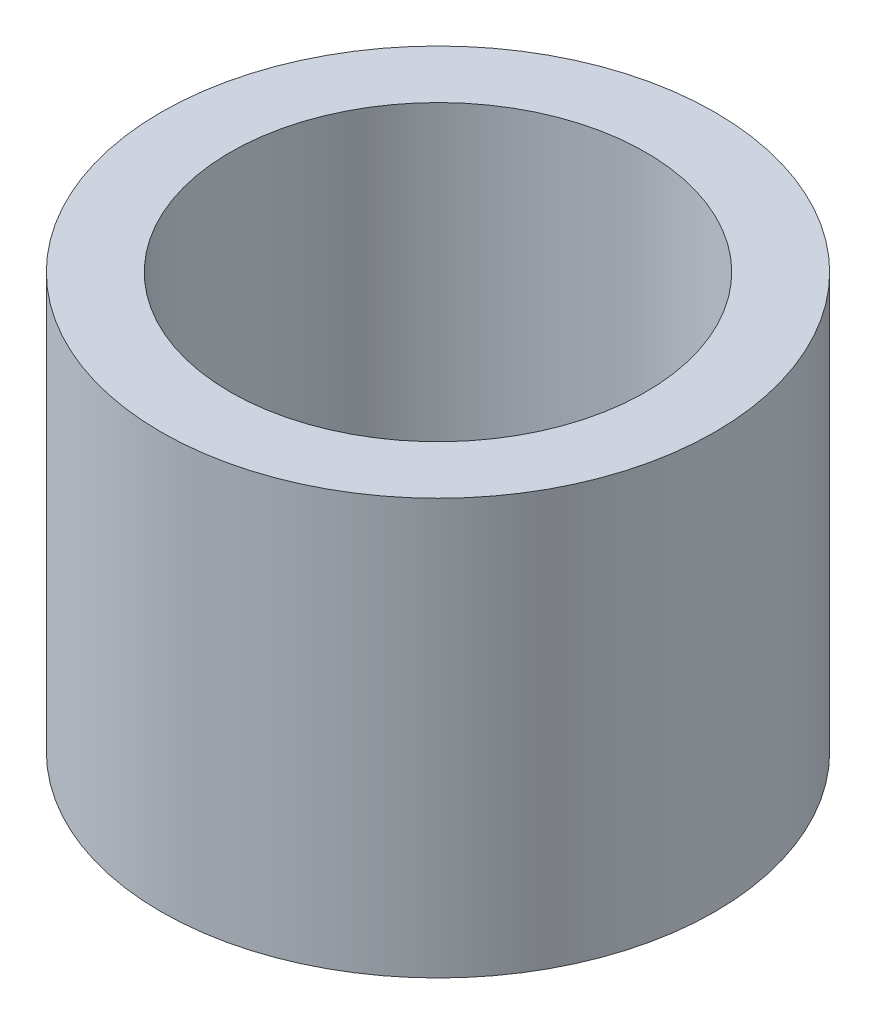
ISO-10303-21;
HEADER;
FILE_DESCRIPTION(('STEP AP214'),'2;1');
FILE_NAME('part.step','',(''),(''),'','','');
FILE_SCHEMA(('AUTOMOTIVE_DESIGN { 1 0 10303 214 1 1 1 1 }'));
ENDSEC;
DATA;
#1=APPLICATION_CONTEXT('core data for automotive mechanical design processes');
#2=APPLICATION_PROTOCOL_DEFINITION('international standard','automotive_design',2000,#1);
#3=PRODUCT_CONTEXT('',#1,'mechanical');
#4=PRODUCT('Part','Part','',(#3));
#5=PRODUCT_RELATED_PRODUCT_CATEGORY('part','',(#4));
#6=PRODUCT_DEFINITION_FORMATION('','',#4);
#7=PRODUCT_DEFINITION_CONTEXT('part definition',#1,'design');
#8=PRODUCT_DEFINITION('design','',#6,#7);
#9=PRODUCT_DEFINITION_SHAPE('','',#8);
#10=(LENGTH_UNIT() NAMED_UNIT(*) SI_UNIT(.MILLI.,.METRE.));
#11=(NAMED_UNIT(*) PLANE_ANGLE_UNIT() SI_UNIT($,.RADIAN.));
#12=(NAMED_UNIT(*) SI_UNIT($,.STERADIAN.) SOLID_ANGLE_UNIT());
#13=UNCERTAINTY_MEASURE_WITH_UNIT(LENGTH_MEASURE(1.E-05),#10,'distance_accuracy_value','');
#14=(GEOMETRIC_REPRESENTATION_CONTEXT(3) GLOBAL_UNCERTAINTY_ASSIGNED_CONTEXT((#13)) GLOBAL_UNIT_ASSIGNED_CONTEXT((#10,
#11,#12)) REPRESENTATION_CONTEXT('',''));
#15=CARTESIAN_POINT('',(0.,0.,0.));
#16=DIRECTION('',(0.,0.,1.));
#17=DIRECTION('',(1.,0.,0.));
#18=AXIS2_PLACEMENT_3D('',#15,#16,#17);
#19=CARTESIAN_POINT('',(0.,6.,0.));
#20=DIRECTION('',(0.,1.,0.));
#21=DIRECTION('',(0.,0.,1.));
#22=AXIS2_PLACEMENT_3D('',#19,#20,#21);
#23=PLANE('',#22);
#24=CARTESIAN_POINT('',(0.,6.,0.));
#25=DIRECTION('',(0.,1.,0.));
#26=DIRECTION('',(0.,0.,1.));
#27=AXIS2_PLACEMENT_3D('',#24,#25,#26);
#28=CIRCLE('',#27,4.);
#29=CARTESIAN_POINT('',(0.,6.,4.));
#30=VERTEX_POINT('',#29);
#31=EDGE_CURVE('E10',#30,#30,#28,.T.);
#32=ORIENTED_EDGE('',*,*,#31,.T.);
#33=EDGE_LOOP('',(#32));
#34=FACE_BOUND('',#33,.T.);
#35=CARTESIAN_POINT('',(0.,6.,0.));
#36=DIRECTION('',(0.,1.,0.));
#37=DIRECTION('',(0.,0.,1.));
#38=AXIS2_PLACEMENT_3D('',#35,#36,#37);
#39=CIRCLE('',#38,3.);
#40=CARTESIAN_POINT('',(0.,6.,3.));
#41=VERTEX_POINT('',#40);
#42=EDGE_CURVE('E41',#41,#41,#39,.T.);
#43=ORIENTED_EDGE('',*,*,#42,.F.);
#44=EDGE_LOOP('',(#43));
#45=FACE_BOUND('',#44,.T.);
#46=ADVANCED_FACE('F30',(#34,#45),#23,.T.);
#47=CARTESIAN_POINT('',(0.,0.,0.));
#48=DIRECTION('',(0.,1.,0.));
#49=DIRECTION('',(0.,0.,1.));
#50=AXIS2_PLACEMENT_3D('',#47,#48,#49);
#51=PLANE('',#50);
#52=CARTESIAN_POINT('',(0.,0.,0.));
#53=DIRECTION('',(0.,1.,0.));
#54=DIRECTION('',(0.,0.,1.));
#55=AXIS2_PLACEMENT_3D('',#52,#53,#54);
#56=CIRCLE('',#55,4.);
#57=CARTESIAN_POINT('',(0.,0.,4.));
#58=VERTEX_POINT('',#57);
#59=EDGE_CURVE('E34',#58,#58,#56,.T.);
#60=ORIENTED_EDGE('',*,*,#59,.F.);
#61=EDGE_LOOP('',(#60));
#62=FACE_BOUND('',#61,.T.);
#63=CARTESIAN_POINT('',(0.,0.,0.));
#64=DIRECTION('',(0.,1.,0.));
#65=DIRECTION('',(0.,0.,1.));
#66=AXIS2_PLACEMENT_3D('',#63,#64,#65);
#67=CIRCLE('',#66,3.);
#68=CARTESIAN_POINT('',(0.,0.,3.));
#69=VERTEX_POINT('',#68);
#70=EDGE_CURVE('E43',#69,#69,#67,.T.);
#71=ORIENTED_EDGE('',*,*,#70,.T.);
#72=EDGE_LOOP('',(#71));
#73=FACE_BOUND('',#72,.T.);
#74=ADVANCED_FACE('F53',(#62,#73),#51,.F.);
#75=CARTESIAN_POINT('',(0.,6.,0.));
#76=DIRECTION('',(0.,-1.,0.));
#77=DIRECTION('',(0.,0.,-1.));
#78=AXIS2_PLACEMENT_3D('',#75,#76,#77);
#79=CYLINDRICAL_SURFACE('',#78,4.);
#80=ORIENTED_EDGE('',*,*,#31,.F.);
#81=EDGE_LOOP('',(#80));
#82=FACE_BOUND('',#81,.T.);
#83=ORIENTED_EDGE('',*,*,#59,.T.);
#84=EDGE_LOOP('',(#83));
#85=FACE_BOUND('',#84,.T.);
#86=ADVANCED_FACE('F32',(#82,#85),#79,.T.);
#87=CARTESIAN_POINT('',(0.,6.,0.));
#88=DIRECTION('',(0.,-1.,0.));
#89=DIRECTION('',(0.,0.,-1.));
#90=AXIS2_PLACEMENT_3D('',#87,#88,#89);
#91=CYLINDRICAL_SURFACE('',#90,3.);
#92=ORIENTED_EDGE('',*,*,#42,.T.);
#93=EDGE_LOOP('',(#92));
#94=FACE_BOUND('',#93,.T.);
#95=ORIENTED_EDGE('',*,*,#70,.F.);
#96=EDGE_LOOP('',(#95));
#97=FACE_BOUND('',#96,.T.);
#98=ADVANCED_FACE('F49',(#94,#97),#91,.F.);
#99=CLOSED_SHELL('',(#46,#74,#86,#98));
#100=MANIFOLD_SOLID_BREP('B2',#99);
#101=ADVANCED_BREP_SHAPE_REPRESENTATION('',(#18,#100),#14);
#102=SHAPE_DEFINITION_REPRESENTATION(#9,#101);
ENDSEC;
END-ISO-10303-21;
